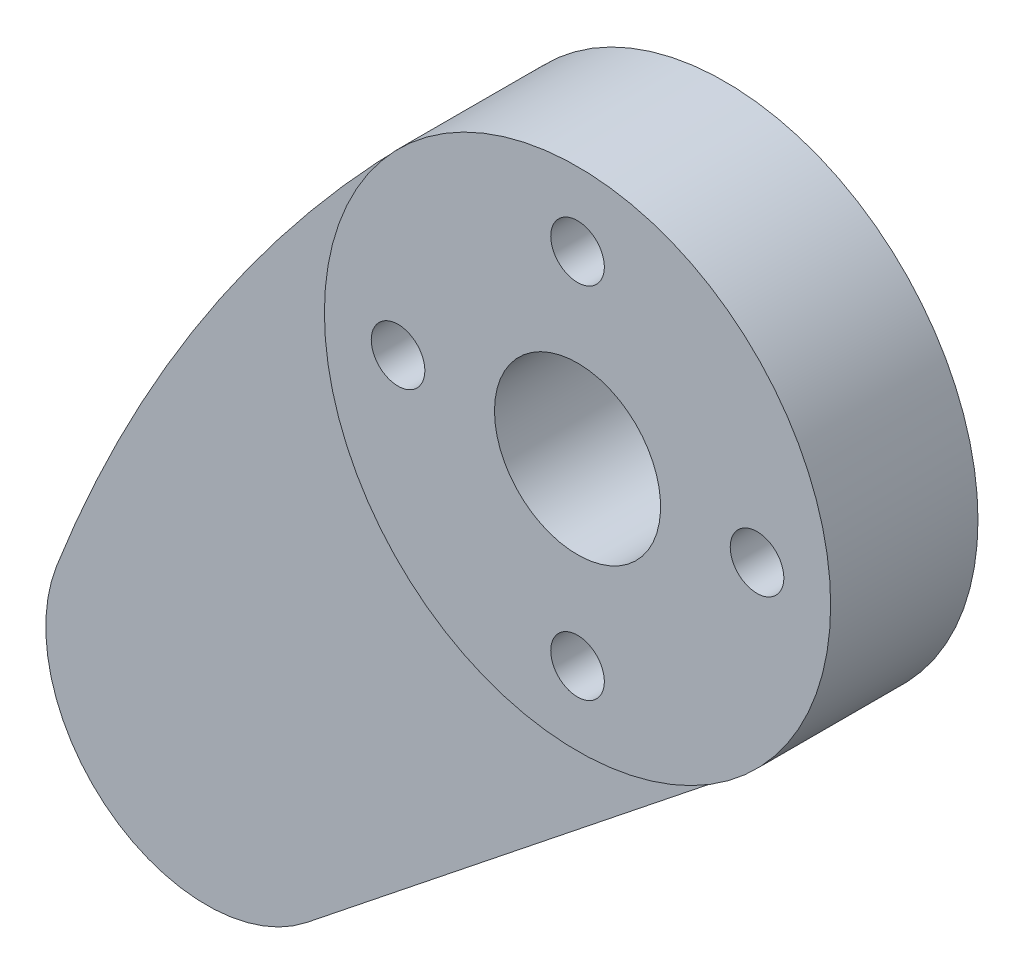
ISO-10303-21;
HEADER;
FILE_DESCRIPTION(('STEP AP214'),'2;1');
FILE_NAME('part.step','',(''),(''),'','','');
FILE_SCHEMA(('AUTOMOTIVE_DESIGN { 1 0 10303 214 1 1 1 1 }'));
ENDSEC;
DATA;
#1=APPLICATION_CONTEXT('core data for automotive mechanical design processes');
#2=APPLICATION_PROTOCOL_DEFINITION('international standard','automotive_design',2000,#1);
#3=PRODUCT_CONTEXT('',#1,'mechanical');
#4=PRODUCT('Part','Part','',(#3));
#5=PRODUCT_RELATED_PRODUCT_CATEGORY('part','',(#4));
#6=PRODUCT_DEFINITION_FORMATION('','',#4);
#7=PRODUCT_DEFINITION_CONTEXT('part definition',#1,'design');
#8=PRODUCT_DEFINITION('design','',#6,#7);
#9=PRODUCT_DEFINITION_SHAPE('','',#8);
#10=(LENGTH_UNIT() NAMED_UNIT(*) SI_UNIT(.MILLI.,.METRE.));
#11=(NAMED_UNIT(*) PLANE_ANGLE_UNIT() SI_UNIT($,.RADIAN.));
#12=(NAMED_UNIT(*) SI_UNIT($,.STERADIAN.) SOLID_ANGLE_UNIT());
#13=UNCERTAINTY_MEASURE_WITH_UNIT(LENGTH_MEASURE(1.E-05),#10,'distance_accuracy_value','');
#14=(GEOMETRIC_REPRESENTATION_CONTEXT(3) GLOBAL_UNCERTAINTY_ASSIGNED_CONTEXT((#13)) GLOBAL_UNIT_ASSIGNED_CONTEXT((#10,
#11,#12)) REPRESENTATION_CONTEXT('',''));
#15=CARTESIAN_POINT('',(0.,0.,0.));
#16=DIRECTION('',(0.,0.,1.));
#17=DIRECTION('',(1.,0.,0.));
#18=AXIS2_PLACEMENT_3D('',#15,#16,#17);
#19=CARTESIAN_POINT('',(86.267181183115,31.8764422805925,3.175));
#20=DIRECTION('',(0.,0.,-1.));
#21=DIRECTION('',(-1.,0.,0.));
#22=AXIS2_PLACEMENT_3D('',#19,#20,#21);
#23=CYLINDRICAL_SURFACE('',#22,7.62);
#24=DIRECTION('',(0.,0.,1.));
#25=VECTOR('',#24,1.);
#26=CARTESIAN_POINT('',(91.0175151091895,25.9183614158521,-26.7969889307368));
#27=LINE('',#26,#25);
#28=CARTESIAN_POINT('',(91.0175151091895,25.9183614158521,0.));
#29=VERTEX_POINT('',#28);
#30=CARTESIAN_POINT('',(91.0175151091895,25.9183614158521,2.54));
#31=VERTEX_POINT('',#30);
#32=EDGE_CURVE('E82',#29,#31,#27,.T.);
#33=ORIENTED_EDGE('',*,*,#32,.T.);
#34=CARTESIAN_POINT('',(86.267181183115,31.8764422805925,2.54));
#35=DIRECTION('',(0.,0.,1.));
#36=DIRECTION('',(1.,0.,0.));
#37=AXIS2_PLACEMENT_3D('',#34,#35,#36);
#38=CIRCLE('',#37,7.62);
#39=CARTESIAN_POINT('',(79.1569800917538,34.6167781068018,2.54));
#40=VERTEX_POINT('',#39);
#41=EDGE_CURVE('E88',#40,#31,#38,.T.);
#42=ORIENTED_EDGE('',*,*,#41,.F.);
#43=DIRECTION('',(0.,0.,-1.));
#44=VECTOR('',#43,1.);
#45=CARTESIAN_POINT('',(79.1569800917538,34.6167781068018,3.175));
#46=LINE('',#45,#44);
#47=CARTESIAN_POINT('',(79.1569800917538,34.6167781068018,0.));
#48=VERTEX_POINT('',#47);
#49=EDGE_CURVE('E50',#40,#48,#46,.T.);
#50=ORIENTED_EDGE('',*,*,#49,.T.);
#51=CARTESIAN_POINT('',(86.267181183115,31.8764422805925,0.));
#52=DIRECTION('',(0.,0.,1.));
#53=DIRECTION('',(1.,0.,0.));
#54=AXIS2_PLACEMENT_3D('',#51,#52,#53);
#55=CIRCLE('',#54,7.62);
#56=EDGE_CURVE('E90',#48,#29,#55,.T.);
#57=ORIENTED_EDGE('',*,*,#56,.T.);
#58=EDGE_LOOP('',(#33,#42,#50,#57));
#59=FACE_BOUND('',#58,.T.);
#60=ADVANCED_FACE('F35',(#59),#23,.T.);
#61=CARTESIAN_POINT('',(0.,0.,3.175));
#62=DIRECTION('',(0.,0.,1.));
#63=DIRECTION('',(1.,0.,0.));
#64=AXIS2_PLACEMENT_3D('',#61,#62,#63);
#65=PLANE('',#64);
#66=CARTESIAN_POINT('',(104.489250000002,43.4974999999998,3.175));
#67=DIRECTION('',(0.,0.,1.));
#68=DIRECTION('',(1.,0.,0.));
#69=AXIS2_PLACEMENT_3D('',#66,#67,#68);
#70=CIRCLE('',#69,1.26999999998563);
#71=CARTESIAN_POINT('',(103.219250000017,43.4974999999998,3.175));
#72=VERTEX_POINT('',#71);
#73=EDGE_CURVE('E97',#72,#72,#70,.T.);
#74=ORIENTED_EDGE('',*,*,#73,.F.);
#75=EDGE_LOOP('',(#74));
#76=FACE_BOUND('',#75,.T.);
#77=CARTESIAN_POINT('',(104.489250000002,60.5154999999998,3.175));
#78=DIRECTION('',(0.,0.,1.));
#79=DIRECTION('',(1.,0.,0.));
#80=AXIS2_PLACEMENT_3D('',#77,#78,#79);
#81=CIRCLE('',#80,1.26999999998563);
#82=CARTESIAN_POINT('',(103.219250000017,60.5154999999998,3.175));
#83=VERTEX_POINT('',#82);
#84=EDGE_CURVE('E108',#83,#83,#81,.T.);
#85=ORIENTED_EDGE('',*,*,#84,.F.);
#86=EDGE_LOOP('',(#85));
#87=FACE_BOUND('',#86,.T.);
#88=CARTESIAN_POINT('',(95.9802500000022,52.0064999999998,3.175));
#89=DIRECTION('',(0.,0.,1.));
#90=DIRECTION('',(1.,0.,0.));
#91=AXIS2_PLACEMENT_3D('',#88,#89,#90);
#92=CIRCLE('',#91,1.26999999998564);
#93=CARTESIAN_POINT('',(94.7102500000166,52.0064999999998,3.175));
#94=VERTEX_POINT('',#93);
#95=EDGE_CURVE('E114',#94,#94,#92,.T.);
#96=ORIENTED_EDGE('',*,*,#95,.F.);
#97=EDGE_LOOP('',(#96));
#98=FACE_BOUND('',#97,.T.);
#99=CARTESIAN_POINT('',(112.998250000002,52.0064999999998,3.175));
#100=DIRECTION('',(0.,0.,1.));
#101=DIRECTION('',(1.,0.,0.));
#102=AXIS2_PLACEMENT_3D('',#99,#100,#101);
#103=CIRCLE('',#102,1.26999999998566);
#104=CARTESIAN_POINT('',(111.728250000017,52.0064999999998,3.175));
#105=VERTEX_POINT('',#104);
#106=EDGE_CURVE('E120',#105,#105,#103,.T.);
#107=ORIENTED_EDGE('',*,*,#106,.F.);
#108=EDGE_LOOP('',(#107));
#109=FACE_BOUND('',#108,.T.);
#110=CARTESIAN_POINT('',(104.489250000002,52.0064999999998,3.175));
#111=DIRECTION('',(0.,0.,1.));
#112=DIRECTION('',(1.,0.,0.));
#113=AXIS2_PLACEMENT_3D('',#110,#111,#112);
#114=CIRCLE('',#113,3.93699999998565);
#115=CARTESIAN_POINT('',(100.552250000017,52.0064999999998,3.175));
#116=VERTEX_POINT('',#115);
#117=EDGE_CURVE('E126',#116,#116,#114,.T.);
#118=ORIENTED_EDGE('',*,*,#117,.F.);
#119=EDGE_LOOP('',(#118));
#120=FACE_BOUND('',#119,.T.);
#121=CARTESIAN_POINT('',(104.489250000002,52.0064999999998,3.175));
#122=DIRECTION('',(0.,0.,1.));
#123=DIRECTION('',(1.,0.,0.));
#124=AXIS2_PLACEMENT_3D('',#121,#122,#123);
#125=CIRCLE('',#124,12.);
#126=CARTESIAN_POINT('',(116.489250000002,52.0064999999998,3.175));
#127=VERTEX_POINT('',#126);
#128=EDGE_CURVE('E132',#127,#127,#125,.T.);
#129=ORIENTED_EDGE('',*,*,#128,.T.);
#130=EDGE_LOOP('',(#129));
#131=FACE_BOUND('',#130,.T.);
#132=ADVANCED_FACE('F174',(#76,#87,#98,#109,#120,#131),#65,.T.);
#133=CARTESIAN_POINT('',(148.495405809727,7.8931215341666,3.175));
#134=DIRECTION('',(0.,0.,-1.));
#135=DIRECTION('',(-1.,0.,0.));
#136=AXIS2_PLACEMENT_3D('',#133,#134,#135);
#137=CYLINDRICAL_SURFACE('',#136,74.3099663683076);
#138=CARTESIAN_POINT('',(148.495405809727,7.8931215341666,2.54));
#139=DIRECTION('',(0.,0.,1.));
#140=DIRECTION('',(1.,0.,0.));
#141=AXIS2_PLACEMENT_3D('',#138,#139,#140);
#142=CIRCLE('',#141,74.3099663683076);
#143=CARTESIAN_POINT('',(96.0142996751163,60.5020998605583,2.54));
#144=VERTEX_POINT('',#143);
#145=EDGE_CURVE('E93',#144,#40,#142,.T.);
#146=ORIENTED_EDGE('',*,*,#145,.F.);
#147=DIRECTION('',(0.,0.,-1.));
#148=VECTOR('',#147,1.);
#149=CARTESIAN_POINT('',(96.0142996751162,60.5020998605583,3.175));
#150=LINE('',#149,#148);
#151=CARTESIAN_POINT('',(96.0142996751322,60.5020998605423,0.));
#152=VERTEX_POINT('',#151);
#153=EDGE_CURVE('E38',#144,#152,#150,.T.);
#154=ORIENTED_EDGE('',*,*,#153,.T.);
#155=CARTESIAN_POINT('',(148.495405809727,7.8931215341666,0.));
#156=DIRECTION('',(0.,0.,1.));
#157=DIRECTION('',(1.,0.,0.));
#158=AXIS2_PLACEMENT_3D('',#155,#156,#157);
#159=CIRCLE('',#158,74.3099663683076);
#160=EDGE_CURVE('E135',#152,#48,#159,.T.);
#161=ORIENTED_EDGE('',*,*,#160,.T.);
#162=ORIENTED_EDGE('',*,*,#49,.F.);
#163=EDGE_LOOP('',(#146,#154,#161,#162));
#164=FACE_BOUND('',#163,.T.);
#165=ADVANCED_FACE('F144',(#164),#137,.T.);
#166=CARTESIAN_POINT('',(0.,0.,0.));
#167=DIRECTION('',(0.,0.,1.));
#168=DIRECTION('',(1.,0.,0.));
#169=AXIS2_PLACEMENT_3D('',#166,#167,#168);
#170=PLANE('',#169);
#171=CARTESIAN_POINT('',(104.489250000002,52.0064999999998,0.));
#172=DIRECTION('',(0.,0.,-1.));
#173=DIRECTION('',(-1.,0.,0.));
#174=AXIS2_PLACEMENT_3D('',#171,#172,#173);
#175=CIRCLE('',#174,11.9999999999777);
#176=CARTESIAN_POINT('',(111.970090828466,42.6236954885976,0.));
#177=VERTEX_POINT('',#176);
#178=EDGE_CURVE('E11',#177,#152,#175,.T.);
#179=ORIENTED_EDGE('',*,*,#178,.F.);
#180=DIRECTION('',(-0.781900375950187,-0.623403402371977,0.));
#181=VECTOR('',#180,1.);
#182=CARTESIAN_POINT('',(22.7386715555523,-28.5198569180819,0.));
#183=LINE('',#182,#181);
#184=EDGE_CURVE('E147',#177,#29,#183,.T.);
#185=ORIENTED_EDGE('',*,*,#184,.T.);
#186=ORIENTED_EDGE('',*,*,#56,.F.);
#187=ORIENTED_EDGE('',*,*,#160,.F.);
#188=EDGE_LOOP('',(#179,#185,#186,#187));
#189=FACE_BOUND('',#188,.T.);
#190=ADVANCED_FACE('F146',(#189),#170,.F.);
#191=CARTESIAN_POINT('',(104.489250000002,52.0064999999998,3.175));
#192=DIRECTION('',(0.,0.,-1.));
#193=DIRECTION('',(-1.,0.,0.));
#194=AXIS2_PLACEMENT_3D('',#191,#192,#193);
#195=CYLINDRICAL_SURFACE('',#194,12.);
#196=CARTESIAN_POINT('',(104.489250000002,52.0064999999998,2.54));
#197=DIRECTION('',(0.,0.,1.));
#198=DIRECTION('',(1.,0.,0.));
#199=AXIS2_PLACEMENT_3D('',#196,#197,#198);
#200=CIRCLE('',#199,11.9999999999889);
#201=CARTESIAN_POINT('',(111.970090828466,42.6236954885976,2.54));
#202=VERTEX_POINT('',#201);
#203=EDGE_CURVE('E99',#144,#202,#200,.T.);
#204=ORIENTED_EDGE('',*,*,#203,.T.);
#205=DIRECTION('',(0.,0.,1.));
#206=VECTOR('',#205,1.);
#207=CARTESIAN_POINT('',(111.970090828466,42.6236954885976,-26.7969889307368));
#208=LINE('',#207,#206);
#209=EDGE_CURVE('E84',#177,#202,#208,.T.);
#210=ORIENTED_EDGE('',*,*,#209,.F.);
#211=ORIENTED_EDGE('',*,*,#178,.T.);
#212=ORIENTED_EDGE('',*,*,#153,.F.);
#213=EDGE_LOOP('',(#204,#210,#211,#212));
#214=FACE_BOUND('',#213,.T.);
#215=ORIENTED_EDGE('',*,*,#128,.F.);
#216=EDGE_LOOP('',(#215));
#217=FACE_BOUND('',#216,.T.);
#218=CARTESIAN_POINT('',(104.489250000002,52.0064999999998,-3.81));
#219=DIRECTION('',(0.,0.,-1.));
#220=DIRECTION('',(-1.,0.,0.));
#221=AXIS2_PLACEMENT_3D('',#218,#219,#220);
#222=CIRCLE('',#221,11.9999999999777);
#223=CARTESIAN_POINT('',(92.4892500000245,52.0064999999998,-3.81));
#224=VERTEX_POINT('',#223);
#225=EDGE_CURVE('E129',#224,#224,#222,.T.);
#226=ORIENTED_EDGE('',*,*,#225,.F.);
#227=EDGE_LOOP('',(#226));
#228=FACE_BOUND('',#227,.T.);
#229=ADVANCED_FACE('F151',(#214,#217,#228),#195,.T.);
#230=CARTESIAN_POINT('',(104.489250000002,52.0064999999998,-3.81));
#231=DIRECTION('',(0.,0.,-1.));
#232=DIRECTION('',(-1.,0.,0.));
#233=AXIS2_PLACEMENT_3D('',#230,#231,#232);
#234=PLANE('',#233);
#235=CARTESIAN_POINT('',(104.489250000002,43.4974999999998,-3.81));
#236=DIRECTION('',(0.,0.,-1.));
#237=DIRECTION('',(-1.,0.,0.));
#238=AXIS2_PLACEMENT_3D('',#235,#236,#237);
#239=CIRCLE('',#238,1.26999999998563);
#240=CARTESIAN_POINT('',(103.219250000017,43.4974999999998,-3.81));
#241=VERTEX_POINT('',#240);
#242=EDGE_CURVE('E94',#241,#241,#239,.T.);
#243=ORIENTED_EDGE('',*,*,#242,.F.);
#244=EDGE_LOOP('',(#243));
#245=FACE_BOUND('',#244,.T.);
#246=CARTESIAN_POINT('',(104.489250000002,60.5154999999998,-3.81));
#247=DIRECTION('',(0.,0.,-1.));
#248=DIRECTION('',(-1.,0.,0.));
#249=AXIS2_PLACEMENT_3D('',#246,#247,#248);
#250=CIRCLE('',#249,1.26999999998563);
#251=CARTESIAN_POINT('',(103.219250000017,60.5154999999998,-3.81));
#252=VERTEX_POINT('',#251);
#253=EDGE_CURVE('E105',#252,#252,#250,.T.);
#254=ORIENTED_EDGE('',*,*,#253,.F.);
#255=EDGE_LOOP('',(#254));
#256=FACE_BOUND('',#255,.T.);
#257=CARTESIAN_POINT('',(95.9802500000022,52.0064999999998,-3.81));
#258=DIRECTION('',(0.,0.,-1.));
#259=DIRECTION('',(-1.,0.,0.));
#260=AXIS2_PLACEMENT_3D('',#257,#258,#259);
#261=CIRCLE('',#260,1.26999999998564);
#262=CARTESIAN_POINT('',(94.7102500000166,52.0064999999998,-3.81));
#263=VERTEX_POINT('',#262);
#264=EDGE_CURVE('E111',#263,#263,#261,.T.);
#265=ORIENTED_EDGE('',*,*,#264,.F.);
#266=EDGE_LOOP('',(#265));
#267=FACE_BOUND('',#266,.T.);
#268=CARTESIAN_POINT('',(112.998250000002,52.0064999999998,-3.81));
#269=DIRECTION('',(0.,0.,-1.));
#270=DIRECTION('',(-1.,0.,0.));
#271=AXIS2_PLACEMENT_3D('',#268,#269,#270);
#272=CIRCLE('',#271,1.26999999998566);
#273=CARTESIAN_POINT('',(111.728250000017,52.0064999999998,-3.81));
#274=VERTEX_POINT('',#273);
#275=EDGE_CURVE('E117',#274,#274,#272,.T.);
#276=ORIENTED_EDGE('',*,*,#275,.F.);
#277=EDGE_LOOP('',(#276));
#278=FACE_BOUND('',#277,.T.);
#279=CARTESIAN_POINT('',(104.489250000002,52.0064999999998,-3.81));
#280=DIRECTION('',(0.,0.,-1.));
#281=DIRECTION('',(-1.,0.,0.));
#282=AXIS2_PLACEMENT_3D('',#279,#280,#281);
#283=CIRCLE('',#282,3.93699999998565);
#284=CARTESIAN_POINT('',(100.552250000017,52.0064999999998,-3.81));
#285=VERTEX_POINT('',#284);
#286=EDGE_CURVE('E123',#285,#285,#283,.T.);
#287=ORIENTED_EDGE('',*,*,#286,.F.);
#288=EDGE_LOOP('',(#287));
#289=FACE_BOUND('',#288,.T.);
#290=ORIENTED_EDGE('',*,*,#225,.T.);
#291=EDGE_LOOP('',(#290));
#292=FACE_BOUND('',#291,.T.);
#293=ADVANCED_FACE('F154',(#245,#256,#267,#278,#289,#292),#234,.T.);
#294=CARTESIAN_POINT('',(104.489250000002,52.0064999999998,3.175025));
#295=DIRECTION('',(0.,0.,-1.));
#296=DIRECTION('',(-1.,0.,0.));
#297=AXIS2_PLACEMENT_3D('',#294,#295,#296);
#298=CYLINDRICAL_SURFACE('',#297,3.93699999998565);
#299=CARTESIAN_POINT('',(100.552250000017,52.0064999999998,3.175));
#300=CARTESIAN_POINT('',(100.552250000017,52.0064999999998,3.10223958333333));
#301=CARTESIAN_POINT('',(100.552250000017,52.0064999999998,3.02947916666667));
#302=CARTESIAN_POINT('',(100.552250000017,52.0064999999998,2.88395833333333));
#303=CARTESIAN_POINT('',(100.552250000017,52.0064999999998,2.81119791666667));
#304=CARTESIAN_POINT('',(100.552250000017,52.0064999999998,2.66567708333333));
#305=CARTESIAN_POINT('',(100.552250000017,52.0064999999998,2.59291666666667));
#306=CARTESIAN_POINT('',(100.552250000017,52.0064999999998,2.44739583333333));
#307=CARTESIAN_POINT('',(100.552250000017,52.0064999999998,2.37463541666667));
#308=CARTESIAN_POINT('',(100.552250000017,52.0064999999998,2.22911458333333));
#309=CARTESIAN_POINT('',(100.552250000017,52.0064999999998,2.15635416666667));
#310=CARTESIAN_POINT('',(100.552250000017,52.0064999999998,2.01083333333333));
#311=CARTESIAN_POINT('',(100.552250000017,52.0064999999998,1.93807291666667));
#312=CARTESIAN_POINT('',(100.552250000017,52.0064999999998,1.79255208333333));
#313=CARTESIAN_POINT('',(100.552250000017,52.0064999999998,1.71979166666667));
#314=CARTESIAN_POINT('',(100.552250000017,52.0064999999998,1.57427083333333));
#315=CARTESIAN_POINT('',(100.552250000017,52.0064999999998,1.50151041666667));
#316=CARTESIAN_POINT('',(100.552250000017,52.0064999999998,1.35598958333333));
#317=CARTESIAN_POINT('',(100.552250000017,52.0064999999998,1.28322916666667));
#318=CARTESIAN_POINT('',(100.552250000017,52.0064999999998,1.13770833333333));
#319=CARTESIAN_POINT('',(100.552250000017,52.0064999999998,1.06494791666667));
#320=CARTESIAN_POINT('',(100.552250000017,52.0064999999998,0.919427083333334));
#321=CARTESIAN_POINT('',(100.552250000017,52.0064999999998,0.846666666666667));
#322=CARTESIAN_POINT('',(100.552250000017,52.0064999999998,0.701145833333334));
#323=CARTESIAN_POINT('',(100.552250000017,52.0064999999998,0.628385416666667));
#324=CARTESIAN_POINT('',(100.552250000017,52.0064999999998,0.482864583333334));
#325=CARTESIAN_POINT('',(100.552250000017,52.0064999999998,0.410104166666667));
#326=CARTESIAN_POINT('',(100.552250000017,52.0064999999998,0.264583333333334));
#327=CARTESIAN_POINT('',(100.552250000017,52.0064999999998,0.191822916666667));
#328=CARTESIAN_POINT('',(100.552250000017,52.0064999999998,0.0463020833333337));
#329=CARTESIAN_POINT('',(100.552250000017,52.0064999999998,-0.0264583333333329));
#330=CARTESIAN_POINT('',(100.552250000017,52.0064999999998,-0.171979166666666));
#331=CARTESIAN_POINT('',(100.552250000017,52.0064999999998,-0.244739583333333));
#332=CARTESIAN_POINT('',(100.552250000017,52.0064999999998,-0.390260416666666));
#333=CARTESIAN_POINT('',(100.552250000017,52.0064999999998,-0.463020833333333));
#334=CARTESIAN_POINT('',(100.552250000017,52.0064999999998,-0.608541666666666));
#335=CARTESIAN_POINT('',(100.552250000017,52.0064999999998,-0.681302083333333));
#336=CARTESIAN_POINT('',(100.552250000017,52.0064999999998,-0.826822916666666));
#337=CARTESIAN_POINT('',(100.552250000017,52.0064999999998,-0.899583333333332));
#338=CARTESIAN_POINT('',(100.552250000017,52.0064999999998,-1.04510416666667));
#339=CARTESIAN_POINT('',(100.552250000017,52.0064999999998,-1.11786458333333));
#340=CARTESIAN_POINT('',(100.552250000017,52.0064999999998,-1.26338541666667));
#341=CARTESIAN_POINT('',(100.552250000017,52.0064999999998,-1.33614583333333));
#342=CARTESIAN_POINT('',(100.552250000017,52.0064999999998,-1.48166666666667));
#343=CARTESIAN_POINT('',(100.552250000017,52.0064999999998,-1.55442708333333));
#344=CARTESIAN_POINT('',(100.552250000017,52.0064999999998,-1.69994791666667));
#345=CARTESIAN_POINT('',(100.552250000017,52.0064999999998,-1.77270833333333));
#346=CARTESIAN_POINT('',(100.552250000017,52.0064999999998,-1.91822916666667));
#347=CARTESIAN_POINT('',(100.552250000017,52.0064999999998,-1.99098958333333));
#348=CARTESIAN_POINT('',(100.552250000017,52.0064999999998,-2.13651041666667));
#349=CARTESIAN_POINT('',(100.552250000017,52.0064999999998,-2.20927083333333));
#350=CARTESIAN_POINT('',(100.552250000017,52.0064999999998,-2.35479166666667));
#351=CARTESIAN_POINT('',(100.552250000017,52.0064999999998,-2.42755208333333));
#352=CARTESIAN_POINT('',(100.552250000017,52.0064999999998,-2.57307291666667));
#353=CARTESIAN_POINT('',(100.552250000017,52.0064999999998,-2.64583333333333));
#354=CARTESIAN_POINT('',(100.552250000017,52.0064999999998,-2.79135416666667));
#355=CARTESIAN_POINT('',(100.552250000017,52.0064999999998,-2.86411458333333));
#356=CARTESIAN_POINT('',(100.552250000017,52.0064999999998,-3.00963541666667));
#357=CARTESIAN_POINT('',(100.552250000017,52.0064999999998,-3.08239583333333));
#358=CARTESIAN_POINT('',(100.552250000017,52.0064999999998,-3.22791666666667));
#359=CARTESIAN_POINT('',(100.552250000017,52.0064999999998,-3.30067708333333));
#360=CARTESIAN_POINT('',(100.552250000017,52.0064999999998,-3.44619791666666));
#361=CARTESIAN_POINT('',(100.552250000017,52.0064999999998,-3.51895833333333));
#362=CARTESIAN_POINT('',(100.552250000017,52.0064999999998,-3.66447916666667));
#363=CARTESIAN_POINT('',(100.552250000017,52.0064999999998,-3.73723958333333));
#364=CARTESIAN_POINT('',(100.552250000017,52.0064999999998,-3.81));
#365=B_SPLINE_CURVE_WITH_KNOTS('',3,(#299,#300,#301,#302,#303,#304,#305,#306,#307,#308,#309,
#310,#311,#312,#313,#314,#315,#316,#317,#318,#319,#320,#321,#322,#323,#324,#325,#326,#327,#328,
#329,#330,#331,#332,#333,#334,#335,#336,#337,#338,#339,#340,#341,#342,#343,#344,#345,#346,#347,
#348,#349,#350,#351,#352,#353,#354,#355,#356,#357,#358,#359,#360,#361,#362,#363,#364),
.UNSPECIFIED.,.F.,.F.,(4,2,2,2,2,2,2,2,2,2,2,2,2,2,2,2,2,2,2,2,2,2,2,2,2,2,2,2,2,2,2,2,4),(0.,
0.21828125,0.4365625,0.65484375,0.873124999999999,1.09140625,1.3096875,1.52796875,1.74625,
1.96453125,2.1828125,2.40109375,2.619375,2.83765625,3.0559375,3.27421875,3.4925,3.71078125,
3.9290625,4.14734375,4.365625,4.58390625,4.8021875,5.02046875,5.23875,5.45703125,5.6753125,
5.89359375,6.111875,6.33015625,6.5484375,6.76671875,6.985),.UNSPECIFIED.);
#366=EDGE_CURVE('BSEAM160',#116,#285,#365,.T.);
#367=ORIENTED_EDGE('',*,*,#117,.T.);
#368=ORIENTED_EDGE('',*,*,#286,.T.);
#369=ORIENTED_EDGE('',*,*,#366,.T.);
#370=ORIENTED_EDGE('',*,*,#366,.F.);
#371=EDGE_LOOP('',(#367,#369,#368,#370));
#372=FACE_BOUND('',#371,.T.);
#373=ADVANCED_FACE('F160',(#372),#298,.F.);
#374=CARTESIAN_POINT('',(112.998250000002,52.0064999999998,3.175025));
#375=DIRECTION('',(0.,0.,-1.));
#376=DIRECTION('',(-1.,0.,0.));
#377=AXIS2_PLACEMENT_3D('',#374,#375,#376);
#378=CYLINDRICAL_SURFACE('',#377,1.26999999998566);
#379=CARTESIAN_POINT('',(111.728250000017,52.0064999999998,3.175));
#380=CARTESIAN_POINT('',(111.728250000017,52.0064999999998,3.10223958333333));
#381=CARTESIAN_POINT('',(111.728250000017,52.0064999999998,3.02947916666667));
#382=CARTESIAN_POINT('',(111.728250000017,52.0064999999998,2.88395833333333));
#383=CARTESIAN_POINT('',(111.728250000017,52.0064999999998,2.81119791666667));
#384=CARTESIAN_POINT('',(111.728250000017,52.0064999999998,2.66567708333333));
#385=CARTESIAN_POINT('',(111.728250000017,52.0064999999998,2.59291666666667));
#386=CARTESIAN_POINT('',(111.728250000017,52.0064999999998,2.44739583333333));
#387=CARTESIAN_POINT('',(111.728250000017,52.0064999999998,2.37463541666667));
#388=CARTESIAN_POINT('',(111.728250000017,52.0064999999998,2.22911458333333));
#389=CARTESIAN_POINT('',(111.728250000017,52.0064999999998,2.15635416666667));
#390=CARTESIAN_POINT('',(111.728250000017,52.0064999999998,2.01083333333333));
#391=CARTESIAN_POINT('',(111.728250000017,52.0064999999998,1.93807291666667));
#392=CARTESIAN_POINT('',(111.728250000017,52.0064999999998,1.79255208333333));
#393=CARTESIAN_POINT('',(111.728250000017,52.0064999999998,1.71979166666667));
#394=CARTESIAN_POINT('',(111.728250000017,52.0064999999998,1.57427083333333));
#395=CARTESIAN_POINT('',(111.728250000017,52.0064999999998,1.50151041666667));
#396=CARTESIAN_POINT('',(111.728250000017,52.0064999999998,1.35598958333333));
#397=CARTESIAN_POINT('',(111.728250000017,52.0064999999998,1.28322916666667));
#398=CARTESIAN_POINT('',(111.728250000017,52.0064999999998,1.13770833333333));
#399=CARTESIAN_POINT('',(111.728250000017,52.0064999999998,1.06494791666667));
#400=CARTESIAN_POINT('',(111.728250000017,52.0064999999998,0.919427083333334));
#401=CARTESIAN_POINT('',(111.728250000017,52.0064999999998,0.846666666666667));
#402=CARTESIAN_POINT('',(111.728250000017,52.0064999999998,0.701145833333334));
#403=CARTESIAN_POINT('',(111.728250000017,52.0064999999998,0.628385416666667));
#404=CARTESIAN_POINT('',(111.728250000017,52.0064999999998,0.482864583333334));
#405=CARTESIAN_POINT('',(111.728250000017,52.0064999999998,0.410104166666667));
#406=CARTESIAN_POINT('',(111.728250000017,52.0064999999998,0.264583333333334));
#407=CARTESIAN_POINT('',(111.728250000017,52.0064999999998,0.191822916666667));
#408=CARTESIAN_POINT('',(111.728250000017,52.0064999999998,0.0463020833333337));
#409=CARTESIAN_POINT('',(111.728250000017,52.0064999999998,-0.0264583333333329));
#410=CARTESIAN_POINT('',(111.728250000017,52.0064999999998,-0.171979166666666));
#411=CARTESIAN_POINT('',(111.728250000017,52.0064999999998,-0.244739583333333));
#412=CARTESIAN_POINT('',(111.728250000017,52.0064999999998,-0.390260416666666));
#413=CARTESIAN_POINT('',(111.728250000017,52.0064999999998,-0.463020833333333));
#414=CARTESIAN_POINT('',(111.728250000017,52.0064999999998,-0.608541666666666));
#415=CARTESIAN_POINT('',(111.728250000017,52.0064999999998,-0.681302083333333));
#416=CARTESIAN_POINT('',(111.728250000017,52.0064999999998,-0.826822916666666));
#417=CARTESIAN_POINT('',(111.728250000017,52.0064999999998,-0.899583333333332));
#418=CARTESIAN_POINT('',(111.728250000017,52.0064999999998,-1.04510416666667));
#419=CARTESIAN_POINT('',(111.728250000017,52.0064999999998,-1.11786458333333));
#420=CARTESIAN_POINT('',(111.728250000017,52.0064999999998,-1.26338541666667));
#421=CARTESIAN_POINT('',(111.728250000017,52.0064999999998,-1.33614583333333));
#422=CARTESIAN_POINT('',(111.728250000017,52.0064999999998,-1.48166666666667));
#423=CARTESIAN_POINT('',(111.728250000017,52.0064999999998,-1.55442708333333));
#424=CARTESIAN_POINT('',(111.728250000017,52.0064999999998,-1.69994791666667));
#425=CARTESIAN_POINT('',(111.728250000017,52.0064999999998,-1.77270833333333));
#426=CARTESIAN_POINT('',(111.728250000017,52.0064999999998,-1.91822916666667));
#427=CARTESIAN_POINT('',(111.728250000017,52.0064999999998,-1.99098958333333));
#428=CARTESIAN_POINT('',(111.728250000017,52.0064999999998,-2.13651041666667));
#429=CARTESIAN_POINT('',(111.728250000017,52.0064999999998,-2.20927083333333));
#430=CARTESIAN_POINT('',(111.728250000017,52.0064999999998,-2.35479166666667));
#431=CARTESIAN_POINT('',(111.728250000017,52.0064999999998,-2.42755208333333));
#432=CARTESIAN_POINT('',(111.728250000017,52.0064999999998,-2.57307291666667));
#433=CARTESIAN_POINT('',(111.728250000017,52.0064999999998,-2.64583333333333));
#434=CARTESIAN_POINT('',(111.728250000017,52.0064999999998,-2.79135416666667));
#435=CARTESIAN_POINT('',(111.728250000017,52.0064999999998,-2.86411458333333));
#436=CARTESIAN_POINT('',(111.728250000017,52.0064999999998,-3.00963541666667));
#437=CARTESIAN_POINT('',(111.728250000017,52.0064999999998,-3.08239583333333));
#438=CARTESIAN_POINT('',(111.728250000017,52.0064999999998,-3.22791666666667));
#439=CARTESIAN_POINT('',(111.728250000017,52.0064999999998,-3.30067708333333));
#440=CARTESIAN_POINT('',(111.728250000017,52.0064999999998,-3.44619791666666));
#441=CARTESIAN_POINT('',(111.728250000017,52.0064999999998,-3.51895833333333));
#442=CARTESIAN_POINT('',(111.728250000017,52.0064999999998,-3.66447916666667));
#443=CARTESIAN_POINT('',(111.728250000017,52.0064999999998,-3.73723958333333));
#444=CARTESIAN_POINT('',(111.728250000017,52.0064999999998,-3.81));
#445=B_SPLINE_CURVE_WITH_KNOTS('',3,(#379,#380,#381,#382,#383,#384,#385,#386,#387,#388,#389,
#390,#391,#392,#393,#394,#395,#396,#397,#398,#399,#400,#401,#402,#403,#404,#405,#406,#407,#408,
#409,#410,#411,#412,#413,#414,#415,#416,#417,#418,#419,#420,#421,#422,#423,#424,#425,#426,#427,
#428,#429,#430,#431,#432,#433,#434,#435,#436,#437,#438,#439,#440,#441,#442,#443,#444),
.UNSPECIFIED.,.F.,.F.,(4,2,2,2,2,2,2,2,2,2,2,2,2,2,2,2,2,2,2,2,2,2,2,2,2,2,2,2,2,2,2,2,4),(0.,
0.21828125,0.4365625,0.65484375,0.873124999999999,1.09140625,1.3096875,1.52796875,1.74625,
1.96453125,2.1828125,2.40109375,2.619375,2.83765625,3.0559375,3.27421875,3.4925,3.71078125,
3.9290625,4.14734375,4.365625,4.58390625,4.8021875,5.02046875,5.23875,5.45703125,5.6753125,
5.89359375,6.111875,6.33015625,6.5484375,6.76671875,6.985),.UNSPECIFIED.);
#446=EDGE_CURVE('BSEAM167',#105,#274,#445,.T.);
#447=ORIENTED_EDGE('',*,*,#106,.T.);
#448=ORIENTED_EDGE('',*,*,#275,.T.);
#449=ORIENTED_EDGE('',*,*,#446,.T.);
#450=ORIENTED_EDGE('',*,*,#446,.F.);
#451=EDGE_LOOP('',(#447,#449,#448,#450));
#452=FACE_BOUND('',#451,.T.);
#453=ADVANCED_FACE('F167',(#452),#378,.F.);
#454=CARTESIAN_POINT('',(95.9802500000022,52.0064999999998,3.175025));
#455=DIRECTION('',(0.,0.,-1.));
#456=DIRECTION('',(-1.,0.,0.));
#457=AXIS2_PLACEMENT_3D('',#454,#455,#456);
#458=CYLINDRICAL_SURFACE('',#457,1.26999999998564);
#459=CARTESIAN_POINT('',(94.7102500000166,52.0064999999998,3.175));
#460=CARTESIAN_POINT('',(94.7102500000166,52.0064999999998,3.10223958333333));
#461=CARTESIAN_POINT('',(94.7102500000166,52.0064999999998,3.02947916666667));
#462=CARTESIAN_POINT('',(94.7102500000166,52.0064999999998,2.88395833333333));
#463=CARTESIAN_POINT('',(94.7102500000166,52.0064999999998,2.81119791666667));
#464=CARTESIAN_POINT('',(94.7102500000166,52.0064999999998,2.66567708333333));
#465=CARTESIAN_POINT('',(94.7102500000166,52.0064999999998,2.59291666666667));
#466=CARTESIAN_POINT('',(94.7102500000166,52.0064999999998,2.44739583333333));
#467=CARTESIAN_POINT('',(94.7102500000166,52.0064999999998,2.37463541666667));
#468=CARTESIAN_POINT('',(94.7102500000166,52.0064999999998,2.22911458333333));
#469=CARTESIAN_POINT('',(94.7102500000166,52.0064999999998,2.15635416666667));
#470=CARTESIAN_POINT('',(94.7102500000166,52.0064999999998,2.01083333333333));
#471=CARTESIAN_POINT('',(94.7102500000166,52.0064999999998,1.93807291666667));
#472=CARTESIAN_POINT('',(94.7102500000166,52.0064999999998,1.79255208333333));
#473=CARTESIAN_POINT('',(94.7102500000166,52.0064999999998,1.71979166666667));
#474=CARTESIAN_POINT('',(94.7102500000166,52.0064999999998,1.57427083333333));
#475=CARTESIAN_POINT('',(94.7102500000166,52.0064999999998,1.50151041666667));
#476=CARTESIAN_POINT('',(94.7102500000166,52.0064999999998,1.35598958333333));
#477=CARTESIAN_POINT('',(94.7102500000166,52.0064999999998,1.28322916666667));
#478=CARTESIAN_POINT('',(94.7102500000166,52.0064999999998,1.13770833333333));
#479=CARTESIAN_POINT('',(94.7102500000166,52.0064999999998,1.06494791666667));
#480=CARTESIAN_POINT('',(94.7102500000166,52.0064999999998,0.919427083333334));
#481=CARTESIAN_POINT('',(94.7102500000166,52.0064999999998,0.846666666666667));
#482=CARTESIAN_POINT('',(94.7102500000166,52.0064999999998,0.701145833333334));
#483=CARTESIAN_POINT('',(94.7102500000166,52.0064999999998,0.628385416666667));
#484=CARTESIAN_POINT('',(94.7102500000166,52.0064999999998,0.482864583333334));
#485=CARTESIAN_POINT('',(94.7102500000166,52.0064999999998,0.410104166666667));
#486=CARTESIAN_POINT('',(94.7102500000166,52.0064999999998,0.264583333333334));
#487=CARTESIAN_POINT('',(94.7102500000166,52.0064999999998,0.191822916666667));
#488=CARTESIAN_POINT('',(94.7102500000166,52.0064999999998,0.0463020833333337));
#489=CARTESIAN_POINT('',(94.7102500000166,52.0064999999998,-0.0264583333333329));
#490=CARTESIAN_POINT('',(94.7102500000166,52.0064999999998,-0.171979166666666));
#491=CARTESIAN_POINT('',(94.7102500000166,52.0064999999998,-0.244739583333333));
#492=CARTESIAN_POINT('',(94.7102500000166,52.0064999999998,-0.390260416666666));
#493=CARTESIAN_POINT('',(94.7102500000166,52.0064999999998,-0.463020833333333));
#494=CARTESIAN_POINT('',(94.7102500000166,52.0064999999998,-0.608541666666666));
#495=CARTESIAN_POINT('',(94.7102500000166,52.0064999999998,-0.681302083333333));
#496=CARTESIAN_POINT('',(94.7102500000166,52.0064999999998,-0.826822916666666));
#497=CARTESIAN_POINT('',(94.7102500000166,52.0064999999998,-0.899583333333332));
#498=CARTESIAN_POINT('',(94.7102500000166,52.0064999999998,-1.04510416666667));
#499=CARTESIAN_POINT('',(94.7102500000166,52.0064999999998,-1.11786458333333));
#500=CARTESIAN_POINT('',(94.7102500000166,52.0064999999998,-1.26338541666667));
#501=CARTESIAN_POINT('',(94.7102500000166,52.0064999999998,-1.33614583333333));
#502=CARTESIAN_POINT('',(94.7102500000166,52.0064999999998,-1.48166666666667));
#503=CARTESIAN_POINT('',(94.7102500000166,52.0064999999998,-1.55442708333333));
#504=CARTESIAN_POINT('',(94.7102500000166,52.0064999999998,-1.69994791666667));
#505=CARTESIAN_POINT('',(94.7102500000166,52.0064999999998,-1.77270833333333));
#506=CARTESIAN_POINT('',(94.7102500000166,52.0064999999998,-1.91822916666667));
#507=CARTESIAN_POINT('',(94.7102500000166,52.0064999999998,-1.99098958333333));
#508=CARTESIAN_POINT('',(94.7102500000166,52.0064999999998,-2.13651041666667));
#509=CARTESIAN_POINT('',(94.7102500000166,52.0064999999998,-2.20927083333333));
#510=CARTESIAN_POINT('',(94.7102500000166,52.0064999999998,-2.35479166666667));
#511=CARTESIAN_POINT('',(94.7102500000166,52.0064999999998,-2.42755208333333));
#512=CARTESIAN_POINT('',(94.7102500000166,52.0064999999998,-2.57307291666667));
#513=CARTESIAN_POINT('',(94.7102500000166,52.0064999999998,-2.64583333333333));
#514=CARTESIAN_POINT('',(94.7102500000166,52.0064999999998,-2.79135416666667));
#515=CARTESIAN_POINT('',(94.7102500000166,52.0064999999998,-2.86411458333333));
#516=CARTESIAN_POINT('',(94.7102500000166,52.0064999999998,-3.00963541666667));
#517=CARTESIAN_POINT('',(94.7102500000166,52.0064999999998,-3.08239583333333));
#518=CARTESIAN_POINT('',(94.7102500000166,52.0064999999998,-3.22791666666667));
#519=CARTESIAN_POINT('',(94.7102500000166,52.0064999999998,-3.30067708333333));
#520=CARTESIAN_POINT('',(94.7102500000166,52.0064999999998,-3.44619791666666));
#521=CARTESIAN_POINT('',(94.7102500000166,52.0064999999998,-3.51895833333333));
#522=CARTESIAN_POINT('',(94.7102500000166,52.0064999999998,-3.66447916666667));
#523=CARTESIAN_POINT('',(94.7102500000166,52.0064999999998,-3.73723958333333));
#524=CARTESIAN_POINT('',(94.7102500000166,52.0064999999998,-3.81));
#525=B_SPLINE_CURVE_WITH_KNOTS('',3,(#459,#460,#461,#462,#463,#464,#465,#466,#467,#468,#469,
#470,#471,#472,#473,#474,#475,#476,#477,#478,#479,#480,#481,#482,#483,#484,#485,#486,#487,#488,
#489,#490,#491,#492,#493,#494,#495,#496,#497,#498,#499,#500,#501,#502,#503,#504,#505,#506,#507,
#508,#509,#510,#511,#512,#513,#514,#515,#516,#517,#518,#519,#520,#521,#522,#523,#524),
.UNSPECIFIED.,.F.,.F.,(4,2,2,2,2,2,2,2,2,2,2,2,2,2,2,2,2,2,2,2,2,2,2,2,2,2,2,2,2,2,2,2,4),(0.,
0.21828125,0.4365625,0.65484375,0.873124999999999,1.09140625,1.3096875,1.52796875,1.74625,
1.96453125,2.1828125,2.40109375,2.619375,2.83765625,3.0559375,3.27421875,3.4925,3.71078125,
3.9290625,4.14734375,4.365625,4.58390625,4.8021875,5.02046875,5.23875,5.45703125,5.6753125,
5.89359375,6.111875,6.33015625,6.5484375,6.76671875,6.985),.UNSPECIFIED.);
#526=EDGE_CURVE('BSEAM287',#94,#263,#525,.T.);
#527=ORIENTED_EDGE('',*,*,#95,.T.);
#528=ORIENTED_EDGE('',*,*,#264,.T.);
#529=ORIENTED_EDGE('',*,*,#526,.T.);
#530=ORIENTED_EDGE('',*,*,#526,.F.);
#531=EDGE_LOOP('',(#527,#529,#528,#530));
#532=FACE_BOUND('',#531,.T.);
#533=ADVANCED_FACE('F287',(#532),#458,.F.);
#534=CARTESIAN_POINT('',(104.489250000002,60.5154999999998,3.175025));
#535=DIRECTION('',(0.,0.,-1.));
#536=DIRECTION('',(-1.,0.,0.));
#537=AXIS2_PLACEMENT_3D('',#534,#535,#536);
#538=CYLINDRICAL_SURFACE('',#537,1.26999999998563);
#539=CARTESIAN_POINT('',(103.219250000017,60.5154999999998,3.175));
#540=CARTESIAN_POINT('',(103.219250000017,60.5154999999998,3.10223958333333));
#541=CARTESIAN_POINT('',(103.219250000017,60.5154999999998,3.02947916666667));
#542=CARTESIAN_POINT('',(103.219250000017,60.5154999999998,2.88395833333333));
#543=CARTESIAN_POINT('',(103.219250000017,60.5154999999998,2.81119791666667));
#544=CARTESIAN_POINT('',(103.219250000017,60.5154999999998,2.66567708333333));
#545=CARTESIAN_POINT('',(103.219250000017,60.5154999999998,2.59291666666667));
#546=CARTESIAN_POINT('',(103.219250000017,60.5154999999998,2.44739583333333));
#547=CARTESIAN_POINT('',(103.219250000017,60.5154999999998,2.37463541666667));
#548=CARTESIAN_POINT('',(103.219250000017,60.5154999999998,2.22911458333333));
#549=CARTESIAN_POINT('',(103.219250000017,60.5154999999998,2.15635416666667));
#550=CARTESIAN_POINT('',(103.219250000017,60.5154999999998,2.01083333333333));
#551=CARTESIAN_POINT('',(103.219250000017,60.5154999999998,1.93807291666667));
#552=CARTESIAN_POINT('',(103.219250000017,60.5154999999998,1.79255208333333));
#553=CARTESIAN_POINT('',(103.219250000017,60.5154999999998,1.71979166666667));
#554=CARTESIAN_POINT('',(103.219250000017,60.5154999999998,1.57427083333333));
#555=CARTESIAN_POINT('',(103.219250000017,60.5154999999998,1.50151041666667));
#556=CARTESIAN_POINT('',(103.219250000017,60.5154999999998,1.35598958333333));
#557=CARTESIAN_POINT('',(103.219250000017,60.5154999999998,1.28322916666667));
#558=CARTESIAN_POINT('',(103.219250000017,60.5154999999998,1.13770833333333));
#559=CARTESIAN_POINT('',(103.219250000017,60.5154999999998,1.06494791666667));
#560=CARTESIAN_POINT('',(103.219250000017,60.5154999999998,0.919427083333334));
#561=CARTESIAN_POINT('',(103.219250000017,60.5154999999998,0.846666666666667));
#562=CARTESIAN_POINT('',(103.219250000017,60.5154999999998,0.701145833333334));
#563=CARTESIAN_POINT('',(103.219250000017,60.5154999999998,0.628385416666667));
#564=CARTESIAN_POINT('',(103.219250000017,60.5154999999998,0.482864583333334));
#565=CARTESIAN_POINT('',(103.219250000017,60.5154999999998,0.410104166666667));
#566=CARTESIAN_POINT('',(103.219250000017,60.5154999999998,0.264583333333334));
#567=CARTESIAN_POINT('',(103.219250000017,60.5154999999998,0.191822916666667));
#568=CARTESIAN_POINT('',(103.219250000017,60.5154999999998,0.0463020833333337));
#569=CARTESIAN_POINT('',(103.219250000017,60.5154999999998,-0.0264583333333329));
#570=CARTESIAN_POINT('',(103.219250000017,60.5154999999998,-0.171979166666666));
#571=CARTESIAN_POINT('',(103.219250000017,60.5154999999998,-0.244739583333333));
#572=CARTESIAN_POINT('',(103.219250000017,60.5154999999998,-0.390260416666666));
#573=CARTESIAN_POINT('',(103.219250000017,60.5154999999998,-0.463020833333333));
#574=CARTESIAN_POINT('',(103.219250000017,60.5154999999998,-0.608541666666666));
#575=CARTESIAN_POINT('',(103.219250000017,60.5154999999998,-0.681302083333333));
#576=CARTESIAN_POINT('',(103.219250000017,60.5154999999998,-0.826822916666666));
#577=CARTESIAN_POINT('',(103.219250000017,60.5154999999998,-0.899583333333332));
#578=CARTESIAN_POINT('',(103.219250000017,60.5154999999998,-1.04510416666667));
#579=CARTESIAN_POINT('',(103.219250000017,60.5154999999998,-1.11786458333333));
#580=CARTESIAN_POINT('',(103.219250000017,60.5154999999998,-1.26338541666667));
#581=CARTESIAN_POINT('',(103.219250000017,60.5154999999998,-1.33614583333333));
#582=CARTESIAN_POINT('',(103.219250000017,60.5154999999998,-1.48166666666667));
#583=CARTESIAN_POINT('',(103.219250000017,60.5154999999998,-1.55442708333333));
#584=CARTESIAN_POINT('',(103.219250000017,60.5154999999998,-1.69994791666667));
#585=CARTESIAN_POINT('',(103.219250000017,60.5154999999998,-1.77270833333333));
#586=CARTESIAN_POINT('',(103.219250000017,60.5154999999998,-1.91822916666667));
#587=CARTESIAN_POINT('',(103.219250000017,60.5154999999998,-1.99098958333333));
#588=CARTESIAN_POINT('',(103.219250000017,60.5154999999998,-2.13651041666667));
#589=CARTESIAN_POINT('',(103.219250000017,60.5154999999998,-2.20927083333333));
#590=CARTESIAN_POINT('',(103.219250000017,60.5154999999998,-2.35479166666667));
#591=CARTESIAN_POINT('',(103.219250000017,60.5154999999998,-2.42755208333333));
#592=CARTESIAN_POINT('',(103.219250000017,60.5154999999998,-2.57307291666667));
#593=CARTESIAN_POINT('',(103.219250000017,60.5154999999998,-2.64583333333333));
#594=CARTESIAN_POINT('',(103.219250000017,60.5154999999998,-2.79135416666667));
#595=CARTESIAN_POINT('',(103.219250000017,60.5154999999998,-2.86411458333333));
#596=CARTESIAN_POINT('',(103.219250000017,60.5154999999998,-3.00963541666667));
#597=CARTESIAN_POINT('',(103.219250000017,60.5154999999998,-3.08239583333333));
#598=CARTESIAN_POINT('',(103.219250000017,60.5154999999998,-3.22791666666667));
#599=CARTESIAN_POINT('',(103.219250000017,60.5154999999998,-3.30067708333333));
#600=CARTESIAN_POINT('',(103.219250000017,60.5154999999998,-3.44619791666666));
#601=CARTESIAN_POINT('',(103.219250000017,60.5154999999998,-3.51895833333333));
#602=CARTESIAN_POINT('',(103.219250000017,60.5154999999998,-3.66447916666667));
#603=CARTESIAN_POINT('',(103.219250000017,60.5154999999998,-3.73723958333333));
#604=CARTESIAN_POINT('',(103.219250000017,60.5154999999998,-3.81));
#605=B_SPLINE_CURVE_WITH_KNOTS('',3,(#539,#540,#541,#542,#543,#544,#545,#546,#547,#548,#549,
#550,#551,#552,#553,#554,#555,#556,#557,#558,#559,#560,#561,#562,#563,#564,#565,#566,#567,#568,
#569,#570,#571,#572,#573,#574,#575,#576,#577,#578,#579,#580,#581,#582,#583,#584,#585,#586,#587,
#588,#589,#590,#591,#592,#593,#594,#595,#596,#597,#598,#599,#600,#601,#602,#603,#604),
.UNSPECIFIED.,.F.,.F.,(4,2,2,2,2,2,2,2,2,2,2,2,2,2,2,2,2,2,2,2,2,2,2,2,2,2,2,2,2,2,2,2,4),(0.,
0.21828125,0.4365625,0.65484375,0.873124999999999,1.09140625,1.3096875,1.52796875,1.74625,
1.96453125,2.1828125,2.40109375,2.619375,2.83765625,3.0559375,3.27421875,3.4925,3.71078125,
3.9290625,4.14734375,4.365625,4.58390625,4.8021875,5.02046875,5.23875,5.45703125,5.6753125,
5.89359375,6.111875,6.33015625,6.5484375,6.76671875,6.985),.UNSPECIFIED.);
#606=EDGE_CURVE('BSEAM276',#83,#252,#605,.T.);
#607=ORIENTED_EDGE('',*,*,#84,.T.);
#608=ORIENTED_EDGE('',*,*,#253,.T.);
#609=ORIENTED_EDGE('',*,*,#606,.T.);
#610=ORIENTED_EDGE('',*,*,#606,.F.);
#611=EDGE_LOOP('',(#607,#609,#608,#610));
#612=FACE_BOUND('',#611,.T.);
#613=ADVANCED_FACE('F276',(#612),#538,.F.);
#614=CARTESIAN_POINT('',(104.489250000002,43.4974999999998,3.175025));
#615=DIRECTION('',(0.,0.,-1.));
#616=DIRECTION('',(-1.,0.,0.));
#617=AXIS2_PLACEMENT_3D('',#614,#615,#616);
#618=CYLINDRICAL_SURFACE('',#617,1.26999999998563);
#619=CARTESIAN_POINT('',(103.219250000017,43.4974999999998,3.175));
#620=CARTESIAN_POINT('',(103.219250000017,43.4974999999998,3.10223958333333));
#621=CARTESIAN_POINT('',(103.219250000017,43.4974999999998,3.02947916666667));
#622=CARTESIAN_POINT('',(103.219250000017,43.4974999999998,2.88395833333333));
#623=CARTESIAN_POINT('',(103.219250000017,43.4974999999998,2.81119791666667));
#624=CARTESIAN_POINT('',(103.219250000017,43.4974999999998,2.66567708333333));
#625=CARTESIAN_POINT('',(103.219250000017,43.4974999999998,2.59291666666667));
#626=CARTESIAN_POINT('',(103.219250000017,43.4974999999998,2.44739583333333));
#627=CARTESIAN_POINT('',(103.219250000017,43.4974999999998,2.37463541666667));
#628=CARTESIAN_POINT('',(103.219250000017,43.4974999999998,2.22911458333333));
#629=CARTESIAN_POINT('',(103.219250000017,43.4974999999998,2.15635416666667));
#630=CARTESIAN_POINT('',(103.219250000017,43.4974999999998,2.01083333333333));
#631=CARTESIAN_POINT('',(103.219250000017,43.4974999999998,1.93807291666667));
#632=CARTESIAN_POINT('',(103.219250000017,43.4974999999998,1.79255208333333));
#633=CARTESIAN_POINT('',(103.219250000017,43.4974999999998,1.71979166666667));
#634=CARTESIAN_POINT('',(103.219250000017,43.4974999999998,1.57427083333333));
#635=CARTESIAN_POINT('',(103.219250000017,43.4974999999998,1.50151041666667));
#636=CARTESIAN_POINT('',(103.219250000017,43.4974999999998,1.35598958333333));
#637=CARTESIAN_POINT('',(103.219250000017,43.4974999999998,1.28322916666667));
#638=CARTESIAN_POINT('',(103.219250000017,43.4974999999998,1.13770833333333));
#639=CARTESIAN_POINT('',(103.219250000017,43.4974999999998,1.06494791666667));
#640=CARTESIAN_POINT('',(103.219250000017,43.4974999999998,0.919427083333334));
#641=CARTESIAN_POINT('',(103.219250000017,43.4974999999998,0.846666666666667));
#642=CARTESIAN_POINT('',(103.219250000017,43.4974999999998,0.701145833333334));
#643=CARTESIAN_POINT('',(103.219250000017,43.4974999999998,0.628385416666667));
#644=CARTESIAN_POINT('',(103.219250000017,43.4974999999998,0.482864583333334));
#645=CARTESIAN_POINT('',(103.219250000017,43.4974999999998,0.410104166666667));
#646=CARTESIAN_POINT('',(103.219250000017,43.4974999999998,0.264583333333334));
#647=CARTESIAN_POINT('',(103.219250000017,43.4974999999998,0.191822916666667));
#648=CARTESIAN_POINT('',(103.219250000017,43.4974999999998,0.0463020833333337));
#649=CARTESIAN_POINT('',(103.219250000017,43.4974999999998,-0.0264583333333329));
#650=CARTESIAN_POINT('',(103.219250000017,43.4974999999998,-0.171979166666666));
#651=CARTESIAN_POINT('',(103.219250000017,43.4974999999998,-0.244739583333333));
#652=CARTESIAN_POINT('',(103.219250000017,43.4974999999998,-0.390260416666666));
#653=CARTESIAN_POINT('',(103.219250000017,43.4974999999998,-0.463020833333333));
#654=CARTESIAN_POINT('',(103.219250000017,43.4974999999998,-0.608541666666666));
#655=CARTESIAN_POINT('',(103.219250000017,43.4974999999998,-0.681302083333333));
#656=CARTESIAN_POINT('',(103.219250000017,43.4974999999998,-0.826822916666666));
#657=CARTESIAN_POINT('',(103.219250000017,43.4974999999998,-0.899583333333332));
#658=CARTESIAN_POINT('',(103.219250000017,43.4974999999998,-1.04510416666667));
#659=CARTESIAN_POINT('',(103.219250000017,43.4974999999998,-1.11786458333333));
#660=CARTESIAN_POINT('',(103.219250000017,43.4974999999998,-1.26338541666667));
#661=CARTESIAN_POINT('',(103.219250000017,43.4974999999998,-1.33614583333333));
#662=CARTESIAN_POINT('',(103.219250000017,43.4974999999998,-1.48166666666667));
#663=CARTESIAN_POINT('',(103.219250000017,43.4974999999998,-1.55442708333333));
#664=CARTESIAN_POINT('',(103.219250000017,43.4974999999998,-1.69994791666667));
#665=CARTESIAN_POINT('',(103.219250000017,43.4974999999998,-1.77270833333333));
#666=CARTESIAN_POINT('',(103.219250000017,43.4974999999998,-1.91822916666667));
#667=CARTESIAN_POINT('',(103.219250000017,43.4974999999998,-1.99098958333333));
#668=CARTESIAN_POINT('',(103.219250000017,43.4974999999998,-2.13651041666667));
#669=CARTESIAN_POINT('',(103.219250000017,43.4974999999998,-2.20927083333333));
#670=CARTESIAN_POINT('',(103.219250000017,43.4974999999998,-2.35479166666667));
#671=CARTESIAN_POINT('',(103.219250000017,43.4974999999998,-2.42755208333333));
#672=CARTESIAN_POINT('',(103.219250000017,43.4974999999998,-2.57307291666667));
#673=CARTESIAN_POINT('',(103.219250000017,43.4974999999998,-2.64583333333333));
#674=CARTESIAN_POINT('',(103.219250000017,43.4974999999998,-2.79135416666667));
#675=CARTESIAN_POINT('',(103.219250000017,43.4974999999998,-2.86411458333333));
#676=CARTESIAN_POINT('',(103.219250000017,43.4974999999998,-3.00963541666667));
#677=CARTESIAN_POINT('',(103.219250000017,43.4974999999998,-3.08239583333333));
#678=CARTESIAN_POINT('',(103.219250000017,43.4974999999998,-3.22791666666667));
#679=CARTESIAN_POINT('',(103.219250000017,43.4974999999998,-3.30067708333333));
#680=CARTESIAN_POINT('',(103.219250000017,43.4974999999998,-3.44619791666666));
#681=CARTESIAN_POINT('',(103.219250000017,43.4974999999998,-3.51895833333333));
#682=CARTESIAN_POINT('',(103.219250000017,43.4974999999998,-3.66447916666667));
#683=CARTESIAN_POINT('',(103.219250000017,43.4974999999998,-3.73723958333333));
#684=CARTESIAN_POINT('',(103.219250000017,43.4974999999998,-3.81));
#685=B_SPLINE_CURVE_WITH_KNOTS('',3,(#619,#620,#621,#622,#623,#624,#625,#626,#627,#628,#629,
#630,#631,#632,#633,#634,#635,#636,#637,#638,#639,#640,#641,#642,#643,#644,#645,#646,#647,#648,
#649,#650,#651,#652,#653,#654,#655,#656,#657,#658,#659,#660,#661,#662,#663,#664,#665,#666,#667,
#668,#669,#670,#671,#672,#673,#674,#675,#676,#677,#678,#679,#680,#681,#682,#683,#684),
.UNSPECIFIED.,.F.,.F.,(4,2,2,2,2,2,2,2,2,2,2,2,2,2,2,2,2,2,2,2,2,2,2,2,2,2,2,2,2,2,2,2,4),(0.,
0.21828125,0.4365625,0.65484375,0.873124999999999,1.09140625,1.3096875,1.52796875,1.74625,
1.96453125,2.1828125,2.40109375,2.619375,2.83765625,3.0559375,3.27421875,3.4925,3.71078125,
3.9290625,4.14734375,4.365625,4.58390625,4.8021875,5.02046875,5.23875,5.45703125,5.6753125,
5.89359375,6.111875,6.33015625,6.5484375,6.76671875,6.985),.UNSPECIFIED.);
#686=EDGE_CURVE('BSEAM200',#72,#241,#685,.T.);
#687=ORIENTED_EDGE('',*,*,#73,.T.);
#688=ORIENTED_EDGE('',*,*,#242,.T.);
#689=ORIENTED_EDGE('',*,*,#686,.T.);
#690=ORIENTED_EDGE('',*,*,#686,.F.);
#691=EDGE_LOOP('',(#687,#689,#688,#690));
#692=FACE_BOUND('',#691,.T.);
#693=ADVANCED_FACE('F200',(#692),#618,.F.);
#694=CARTESIAN_POINT('',(0.,0.,2.54));
#695=DIRECTION('',(0.,0.,1.));
#696=DIRECTION('',(1.,0.,0.));
#697=AXIS2_PLACEMENT_3D('',#694,#695,#696);
#698=PLANE('',#697);
#699=DIRECTION('',(0.781900375950187,0.623403402371977,0.));
#700=VECTOR('',#699,1.);
#701=CARTESIAN_POINT('',(22.7386715555523,-28.5198569180819,2.54));
#702=LINE('',#701,#700);
#703=EDGE_CURVE('E78',#31,#202,#702,.T.);
#704=ORIENTED_EDGE('',*,*,#703,.T.);
#705=ORIENTED_EDGE('',*,*,#203,.F.);
#706=ORIENTED_EDGE('',*,*,#145,.T.);
#707=ORIENTED_EDGE('',*,*,#41,.T.);
#708=EDGE_LOOP('',(#704,#705,#706,#707));
#709=FACE_BOUND('',#708,.T.);
#710=ADVANCED_FACE('F92',(#709),#698,.T.);
#711=CARTESIAN_POINT('',(22.7386715555523,-28.5198569180819,-26.7969889307368));
#712=DIRECTION('',(0.623403402371976,-0.781900375950187,0.));
#713=DIRECTION('',(0.781900375950187,0.623403402371977,0.));
#714=AXIS2_PLACEMENT_3D('',#711,#712,#713);
#715=PLANE('',#714);
#716=ORIENTED_EDGE('',*,*,#184,.F.);
#717=ORIENTED_EDGE('',*,*,#209,.T.);
#718=ORIENTED_EDGE('',*,*,#703,.F.);
#719=ORIENTED_EDGE('',*,*,#32,.F.);
#720=EDGE_LOOP('',(#716,#717,#718,#719));
#721=FACE_BOUND('',#720,.T.);
#722=ADVANCED_FACE('F81',(#721),#715,.T.);
#723=CLOSED_SHELL('',(#60,#132,#165,#190,#229,#293,#373,#453,#533,#613,#693,#710,#722));
#724=MANIFOLD_SOLID_BREP('B2',#723);
#725=ADVANCED_BREP_SHAPE_REPRESENTATION('',(#18,#724),#14);
#726=SHAPE_DEFINITION_REPRESENTATION(#9,#725);
ENDSEC;
END-ISO-10303-21;
